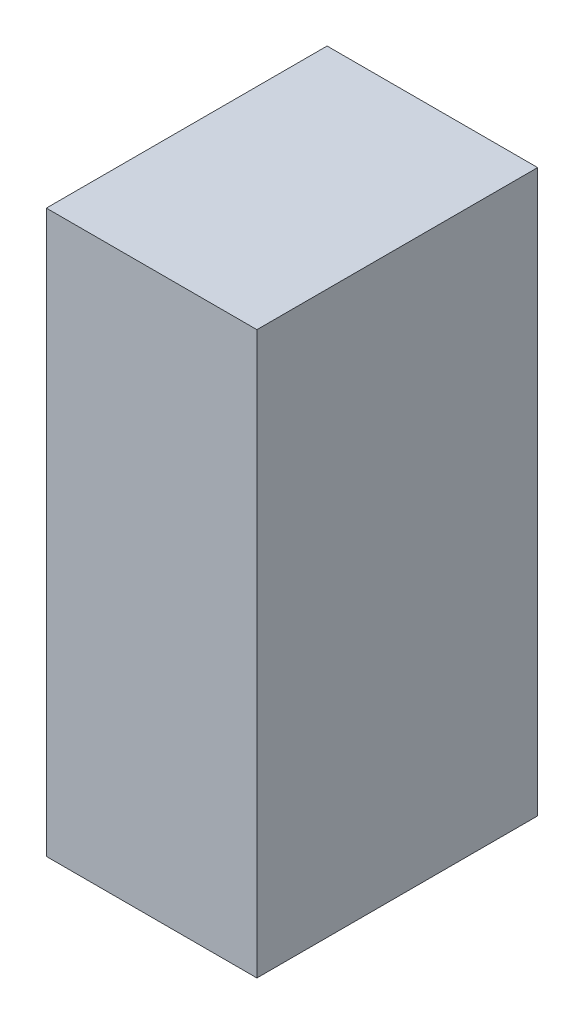
ISO-10303-21;
HEADER;
FILE_DESCRIPTION(('STEP AP214'),'2;1');
FILE_NAME('part.step','',(''),(''),'','','');
FILE_SCHEMA(('AUTOMOTIVE_DESIGN { 1 0 10303 214 1 1 1 1 }'));
ENDSEC;
DATA;
#1=APPLICATION_CONTEXT('core data for automotive mechanical design processes');
#2=APPLICATION_PROTOCOL_DEFINITION('international standard','automotive_design',2000,#1);
#3=PRODUCT_CONTEXT('',#1,'mechanical');
#4=PRODUCT('Part','Part','',(#3));
#5=PRODUCT_RELATED_PRODUCT_CATEGORY('part','',(#4));
#6=PRODUCT_DEFINITION_FORMATION('','',#4);
#7=PRODUCT_DEFINITION_CONTEXT('part definition',#1,'design');
#8=PRODUCT_DEFINITION('design','',#6,#7);
#9=PRODUCT_DEFINITION_SHAPE('','',#8);
#10=(LENGTH_UNIT() NAMED_UNIT(*) SI_UNIT(.MILLI.,.METRE.));
#11=(NAMED_UNIT(*) PLANE_ANGLE_UNIT() SI_UNIT($,.RADIAN.));
#12=(NAMED_UNIT(*) SI_UNIT($,.STERADIAN.) SOLID_ANGLE_UNIT());
#13=UNCERTAINTY_MEASURE_WITH_UNIT(LENGTH_MEASURE(1.E-05),#10,'distance_accuracy_value','');
#14=(GEOMETRIC_REPRESENTATION_CONTEXT(3) GLOBAL_UNCERTAINTY_ASSIGNED_CONTEXT((#13)) GLOBAL_UNIT_ASSIGNED_CONTEXT((#10,
#11,#12)) REPRESENTATION_CONTEXT('',''));
#15=CARTESIAN_POINT('',(0.,0.,0.));
#16=DIRECTION('',(0.,0.,1.));
#17=DIRECTION('',(1.,0.,0.));
#18=AXIS2_PLACEMENT_3D('',#15,#16,#17);
#19=CARTESIAN_POINT('',(0.,4.,0.));
#20=DIRECTION('',(1.,0.,0.));
#21=DIRECTION('',(0.,0.,-1.));
#22=AXIS2_PLACEMENT_3D('',#19,#20,#21);
#23=PLANE('',#22);
#24=DIRECTION('',(0.,0.,1.));
#25=VECTOR('',#24,1.);
#26=CARTESIAN_POINT('',(0.,0.,0.));
#27=LINE('',#26,#25);
#28=CARTESIAN_POINT('',(0.,0.,0.));
#29=VERTEX_POINT('',#28);
#30=CARTESIAN_POINT('',(0.,0.,2.));
#31=VERTEX_POINT('',#30);
#32=EDGE_CURVE('E101',#29,#31,#27,.T.);
#33=ORIENTED_EDGE('',*,*,#32,.T.);
#34=DIRECTION('',(0.,-1.,0.));
#35=VECTOR('',#34,1.);
#36=CARTESIAN_POINT('',(0.,4.,2.));
#37=LINE('',#36,#35);
#38=CARTESIAN_POINT('',(0.,4.,2.));
#39=VERTEX_POINT('',#38);
#40=EDGE_CURVE('E11',#39,#31,#37,.T.);
#41=ORIENTED_EDGE('',*,*,#40,.F.);
#42=DIRECTION('',(0.,0.,1.));
#43=VECTOR('',#42,1.);
#44=CARTESIAN_POINT('',(0.,4.,0.));
#45=LINE('',#44,#43);
#46=CARTESIAN_POINT('',(0.,4.,0.));
#47=VERTEX_POINT('',#46);
#48=EDGE_CURVE('E89',#47,#39,#45,.T.);
#49=ORIENTED_EDGE('',*,*,#48,.F.);
#50=DIRECTION('',(0.,-1.,0.));
#51=VECTOR('',#50,1.);
#52=CARTESIAN_POINT('',(0.,4.,0.));
#53=LINE('',#52,#51);
#54=EDGE_CURVE('E97',#47,#29,#53,.T.);
#55=ORIENTED_EDGE('',*,*,#54,.T.);
#56=EDGE_LOOP('',(#33,#41,#49,#55));
#57=FACE_BOUND('',#56,.T.);
#58=ADVANCED_FACE('F38',(#57),#23,.F.);
#59=CARTESIAN_POINT('',(0.,4.,2.));
#60=DIRECTION('',(0.,0.,-1.));
#61=DIRECTION('',(-1.,0.,0.));
#62=AXIS2_PLACEMENT_3D('',#59,#60,#61);
#63=PLANE('',#62);
#64=DIRECTION('',(1.,0.,0.));
#65=VECTOR('',#64,1.);
#66=CARTESIAN_POINT('',(0.,0.,2.));
#67=LINE('',#66,#65);
#68=CARTESIAN_POINT('',(1.5,0.,2.));
#69=VERTEX_POINT('',#68);
#70=EDGE_CURVE('E93',#31,#69,#67,.T.);
#71=ORIENTED_EDGE('',*,*,#70,.T.);
#72=DIRECTION('',(0.,-1.,0.));
#73=VECTOR('',#72,1.);
#74=CARTESIAN_POINT('',(1.5,4.,2.));
#75=LINE('',#74,#73);
#76=CARTESIAN_POINT('',(1.5,4.,2.));
#77=VERTEX_POINT('',#76);
#78=EDGE_CURVE('E46',#77,#69,#75,.T.);
#79=ORIENTED_EDGE('',*,*,#78,.F.);
#80=DIRECTION('',(1.,0.,0.));
#81=VECTOR('',#80,1.);
#82=CARTESIAN_POINT('',(0.,4.,2.));
#83=LINE('',#82,#81);
#84=EDGE_CURVE('E84',#39,#77,#83,.T.);
#85=ORIENTED_EDGE('',*,*,#84,.F.);
#86=ORIENTED_EDGE('',*,*,#40,.T.);
#87=EDGE_LOOP('',(#71,#79,#85,#86));
#88=FACE_BOUND('',#87,.T.);
#89=ADVANCED_FACE('F92',(#88),#63,.F.);
#90=CARTESIAN_POINT('',(1.5,4.,0.));
#91=DIRECTION('',(-1.,0.,0.));
#92=DIRECTION('',(0.,0.,1.));
#93=AXIS2_PLACEMENT_3D('',#90,#91,#92);
#94=PLANE('',#93);
#95=DIRECTION('',(0.,0.,-1.));
#96=VECTOR('',#95,1.);
#97=CARTESIAN_POINT('',(1.5,0.,0.));
#98=LINE('',#97,#96);
#99=CARTESIAN_POINT('',(1.5,0.,0.));
#100=VERTEX_POINT('',#99);
#101=EDGE_CURVE('E71',#69,#100,#98,.T.);
#102=ORIENTED_EDGE('',*,*,#101,.T.);
#103=DIRECTION('',(0.,-1.,0.));
#104=VECTOR('',#103,1.);
#105=CARTESIAN_POINT('',(1.5,4.,0.));
#106=LINE('',#105,#104);
#107=CARTESIAN_POINT('',(1.5,4.,0.));
#108=VERTEX_POINT('',#107);
#109=EDGE_CURVE('E94',#108,#100,#106,.T.);
#110=ORIENTED_EDGE('',*,*,#109,.F.);
#111=DIRECTION('',(0.,0.,-1.));
#112=VECTOR('',#111,1.);
#113=CARTESIAN_POINT('',(1.5,4.,0.));
#114=LINE('',#113,#112);
#115=EDGE_CURVE('E87',#77,#108,#114,.T.);
#116=ORIENTED_EDGE('',*,*,#115,.F.);
#117=ORIENTED_EDGE('',*,*,#78,.T.);
#118=EDGE_LOOP('',(#102,#110,#116,#117));
#119=FACE_BOUND('',#118,.T.);
#120=ADVANCED_FACE('F95',(#119),#94,.F.);
#121=CARTESIAN_POINT('',(0.,4.,0.));
#122=DIRECTION('',(0.,0.,1.));
#123=DIRECTION('',(1.,0.,0.));
#124=AXIS2_PLACEMENT_3D('',#121,#122,#123);
#125=PLANE('',#124);
#126=DIRECTION('',(-1.,0.,0.));
#127=VECTOR('',#126,1.);
#128=CARTESIAN_POINT('',(0.,0.,0.));
#129=LINE('',#128,#127);
#130=EDGE_CURVE('E77',#100,#29,#129,.T.);
#131=ORIENTED_EDGE('',*,*,#130,.T.);
#132=ORIENTED_EDGE('',*,*,#54,.F.);
#133=DIRECTION('',(-1.,0.,0.));
#134=VECTOR('',#133,1.);
#135=CARTESIAN_POINT('',(0.,4.,0.));
#136=LINE('',#135,#134);
#137=EDGE_CURVE('E54',#108,#47,#136,.T.);
#138=ORIENTED_EDGE('',*,*,#137,.F.);
#139=ORIENTED_EDGE('',*,*,#109,.T.);
#140=EDGE_LOOP('',(#131,#132,#138,#139));
#141=FACE_BOUND('',#140,.T.);
#142=ADVANCED_FACE('F108',(#141),#125,.F.);
#143=CARTESIAN_POINT('',(0.,4.,0.));
#144=DIRECTION('',(0.,1.,0.));
#145=DIRECTION('',(0.,0.,1.));
#146=AXIS2_PLACEMENT_3D('',#143,#144,#145);
#147=PLANE('',#146);
#148=ORIENTED_EDGE('',*,*,#48,.T.);
#149=ORIENTED_EDGE('',*,*,#84,.T.);
#150=ORIENTED_EDGE('',*,*,#115,.T.);
#151=ORIENTED_EDGE('',*,*,#137,.T.);
#152=EDGE_LOOP('',(#148,#149,#150,#151));
#153=FACE_BOUND('',#152,.T.);
#154=ADVANCED_FACE('F85',(#153),#147,.T.);
#155=CARTESIAN_POINT('',(0.,0.,0.));
#156=DIRECTION('',(0.,1.,0.));
#157=DIRECTION('',(0.,0.,1.));
#158=AXIS2_PLACEMENT_3D('',#155,#156,#157);
#159=PLANE('',#158);
#160=ORIENTED_EDGE('',*,*,#32,.F.);
#161=ORIENTED_EDGE('',*,*,#130,.F.);
#162=ORIENTED_EDGE('',*,*,#101,.F.);
#163=ORIENTED_EDGE('',*,*,#70,.F.);
#164=EDGE_LOOP('',(#160,#161,#162,#163));
#165=FACE_BOUND('',#164,.T.);
#166=ADVANCED_FACE('F111',(#165),#159,.F.);
#167=CLOSED_SHELL('',(#58,#89,#120,#142,#154,#166));
#168=MANIFOLD_SOLID_BREP('B2',#167);
#169=ADVANCED_BREP_SHAPE_REPRESENTATION('',(#18,#168),#14);
#170=SHAPE_DEFINITION_REPRESENTATION(#9,#169);
ENDSEC;
END-ISO-10303-21;
